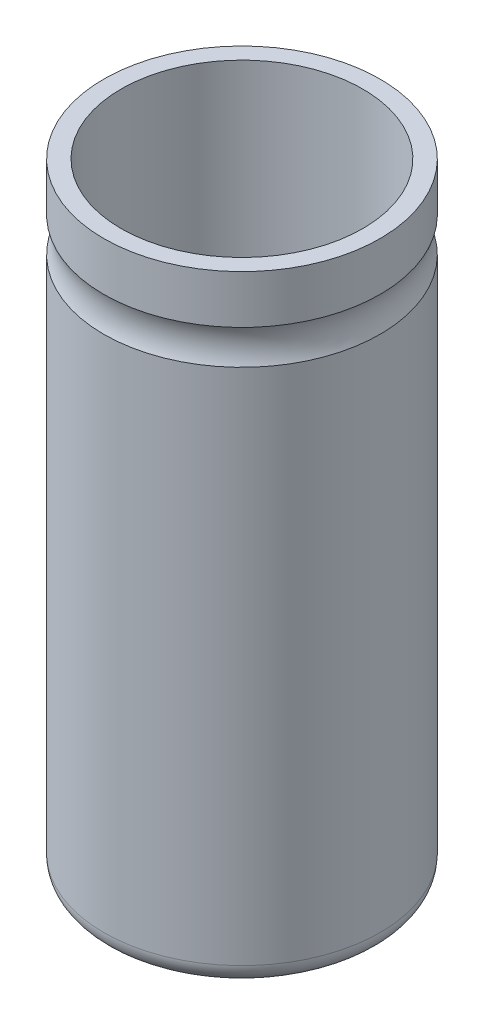
ISO-10303-21;
HEADER;
FILE_DESCRIPTION(('STEP AP214'),'2;1');
FILE_NAME('part.step','',(''),(''),'','','');
FILE_SCHEMA(('AUTOMOTIVE_DESIGN { 1 0 10303 214 1 1 1 1 }'));
ENDSEC;
DATA;
#1=APPLICATION_CONTEXT('core data for automotive mechanical design processes');
#2=APPLICATION_PROTOCOL_DEFINITION('international standard','automotive_design',2000,#1);
#3=PRODUCT_CONTEXT('',#1,'mechanical');
#4=PRODUCT('Part','Part','',(#3));
#5=PRODUCT_RELATED_PRODUCT_CATEGORY('part','',(#4));
#6=PRODUCT_DEFINITION_FORMATION('','',#4);
#7=PRODUCT_DEFINITION_CONTEXT('part definition',#1,'design');
#8=PRODUCT_DEFINITION('design','',#6,#7);
#9=PRODUCT_DEFINITION_SHAPE('','',#8);
#10=(LENGTH_UNIT() NAMED_UNIT(*) SI_UNIT(.MILLI.,.METRE.));
#11=(NAMED_UNIT(*) PLANE_ANGLE_UNIT() SI_UNIT($,.RADIAN.));
#12=(NAMED_UNIT(*) SI_UNIT($,.STERADIAN.) SOLID_ANGLE_UNIT());
#13=UNCERTAINTY_MEASURE_WITH_UNIT(LENGTH_MEASURE(1.E-05),#10,'distance_accuracy_value','');
#14=(GEOMETRIC_REPRESENTATION_CONTEXT(3) GLOBAL_UNCERTAINTY_ASSIGNED_CONTEXT((#13)) GLOBAL_UNIT_ASSIGNED_CONTEXT((#10,
#11,#12)) REPRESENTATION_CONTEXT('',''));
#15=CARTESIAN_POINT('',(0.,0.,0.));
#16=DIRECTION('',(0.,0.,1.));
#17=DIRECTION('',(1.,0.,0.));
#18=AXIS2_PLACEMENT_3D('',#15,#16,#17);
#19=CARTESIAN_POINT('',(0.,0.,0.));
#20=DIRECTION('',(0.,1.,0.));
#21=DIRECTION('',(0.,0.,1.));
#22=AXIS2_PLACEMENT_3D('',#19,#20,#21);
#23=PLANE('',#22);
#24=CARTESIAN_POINT('',(0.,0.,0.));
#25=DIRECTION('',(0.,1.,0.));
#26=DIRECTION('',(0.,0.,1.));
#27=AXIS2_PLACEMENT_3D('',#24,#25,#26);
#28=CIRCLE('',#27,17000.);
#29=CARTESIAN_POINT('',(0.,0.,17000.));
#30=VERTEX_POINT('',#29);
#31=EDGE_CURVE('E10',#30,#30,#28,.F.);
#32=ORIENTED_EDGE('',*,*,#31,.T.);
#33=EDGE_LOOP('',(#32));
#34=FACE_BOUND('',#33,.T.);
#35=ADVANCED_FACE('F43',(#34),#23,.F.);
#36=CARTESIAN_POINT('',(0.,3000.,0.));
#37=DIRECTION('',(0.,1.,0.));
#38=DIRECTION('',(0.,0.,1.));
#39=AXIS2_PLACEMENT_3D('',#36,#37,#38);
#40=CYLINDRICAL_SURFACE('',#39,20000.);
#41=CARTESIAN_POINT('',(0.,3000.,0.));
#42=DIRECTION('',(0.,1.,0.));
#43=DIRECTION('',(0.,0.,1.));
#44=AXIS2_PLACEMENT_3D('',#41,#42,#43);
#45=CIRCLE('',#44,20000.);
#46=CARTESIAN_POINT('',(0.,3000.,20000.));
#47=VERTEX_POINT('',#46);
#48=EDGE_CURVE('E51',#47,#47,#45,.T.);
#49=ORIENTED_EDGE('',*,*,#48,.T.);
#50=EDGE_LOOP('',(#49));
#51=FACE_BOUND('',#50,.T.);
#52=CARTESIAN_POINT('',(0.,78000.,0.));
#53=DIRECTION('',(0.,1.,0.));
#54=DIRECTION('',(0.,0.,1.));
#55=AXIS2_PLACEMENT_3D('',#52,#53,#54);
#56=CIRCLE('',#55,20000.);
#57=CARTESIAN_POINT('',(0.,78000.,20000.));
#58=VERTEX_POINT('',#57);
#59=EDGE_CURVE('E56',#58,#58,#56,.T.);
#60=ORIENTED_EDGE('',*,*,#59,.F.);
#61=EDGE_LOOP('',(#60));
#62=FACE_BOUND('',#61,.T.);
#63=ADVANCED_FACE('F103',(#51,#62),#40,.T.);
#64=CARTESIAN_POINT('',(0.,80500.,0.));
#65=DIRECTION('',(0.,1.,0.));
#66=DIRECTION('',(0.,0.,1.));
#67=AXIS2_PLACEMENT_3D('',#64,#65,#66);
#68=TOROIDAL_SURFACE('',#67,25454.3560573179,6000.);
#69=CARTESIAN_POINT('',(0.,83000.,0.));
#70=DIRECTION('',(0.,1.,0.));
#71=DIRECTION('',(0.,0.,1.));
#72=AXIS2_PLACEMENT_3D('',#69,#70,#71);
#73=CIRCLE('',#72,20000.);
#74=CARTESIAN_POINT('',(0.,83000.,20000.));
#75=VERTEX_POINT('',#74);
#76=EDGE_CURVE('E61',#75,#75,#73,.T.);
#77=ORIENTED_EDGE('',*,*,#76,.F.);
#78=EDGE_LOOP('',(#77));
#79=FACE_BOUND('',#78,.T.);
#80=ORIENTED_EDGE('',*,*,#59,.T.);
#81=EDGE_LOOP('',(#80));
#82=FACE_BOUND('',#81,.T.);
#83=ADVANCED_FACE('F97',(#79,#82),#68,.F.);
#84=CARTESIAN_POINT('',(0.,3000.,0.));
#85=DIRECTION('',(0.,1.,0.));
#86=DIRECTION('',(0.,0.,1.));
#87=AXIS2_PLACEMENT_3D('',#84,#85,#86);
#88=CYLINDRICAL_SURFACE('',#87,20000.);
#89=CARTESIAN_POINT('',(0.,90000.,0.));
#90=DIRECTION('',(0.,1.,0.));
#91=DIRECTION('',(0.,0.,1.));
#92=AXIS2_PLACEMENT_3D('',#89,#90,#91);
#93=CIRCLE('',#92,20000.);
#94=CARTESIAN_POINT('',(0.,90000.,20000.));
#95=VERTEX_POINT('',#94);
#96=EDGE_CURVE('E67',#95,#95,#93,.T.);
#97=ORIENTED_EDGE('',*,*,#96,.F.);
#98=EDGE_LOOP('',(#97));
#99=FACE_BOUND('',#98,.T.);
#100=ORIENTED_EDGE('',*,*,#76,.T.);
#101=EDGE_LOOP('',(#100));
#102=FACE_BOUND('',#101,.T.);
#103=ADVANCED_FACE('F91',(#99,#102),#88,.T.);
#104=CARTESIAN_POINT('',(17500.,90000.,0.));
#105=DIRECTION('',(0.,-1.,0.));
#106=DIRECTION('',(0.,0.,-1.));
#107=AXIS2_PLACEMENT_3D('',#104,#105,#106);
#108=PLANE('',#107);
#109=CARTESIAN_POINT('',(0.,90000.,0.));
#110=DIRECTION('',(0.,1.,0.));
#111=DIRECTION('',(0.,0.,1.));
#112=AXIS2_PLACEMENT_3D('',#109,#110,#111);
#113=CIRCLE('',#112,17500.);
#114=CARTESIAN_POINT('',(0.,90000.,17500.));
#115=VERTEX_POINT('',#114);
#116=EDGE_CURVE('E71',#115,#115,#113,.T.);
#117=ORIENTED_EDGE('',*,*,#116,.F.);
#118=EDGE_LOOP('',(#117));
#119=FACE_BOUND('',#118,.T.);
#120=ORIENTED_EDGE('',*,*,#96,.T.);
#121=EDGE_LOOP('',(#120));
#122=FACE_BOUND('',#121,.T.);
#123=ADVANCED_FACE('F85',(#119,#122),#108,.F.);
#124=CARTESIAN_POINT('',(0.,3000.,0.));
#125=DIRECTION('',(0.,1.,0.));
#126=DIRECTION('',(0.,0.,1.));
#127=AXIS2_PLACEMENT_3D('',#124,#125,#126);
#128=CYLINDRICAL_SURFACE('',#127,17500.);
#129=CARTESIAN_POINT('',(0.,3000.,0.));
#130=DIRECTION('',(0.,1.,0.));
#131=DIRECTION('',(0.,0.,1.));
#132=AXIS2_PLACEMENT_3D('',#129,#130,#131);
#133=CIRCLE('',#132,17500.);
#134=CARTESIAN_POINT('',(0.,3000.,17500.));
#135=VERTEX_POINT('',#134);
#136=EDGE_CURVE('E75',#135,#135,#133,.T.);
#137=ORIENTED_EDGE('',*,*,#136,.F.);
#138=EDGE_LOOP('',(#137));
#139=FACE_BOUND('',#138,.T.);
#140=ORIENTED_EDGE('',*,*,#116,.T.);
#141=EDGE_LOOP('',(#140));
#142=FACE_BOUND('',#141,.T.);
#143=ADVANCED_FACE('F82',(#139,#142),#128,.F.);
#144=CARTESIAN_POINT('',(17500.,3000.,0.));
#145=DIRECTION('',(0.,-1.,0.));
#146=DIRECTION('',(0.,0.,-1.));
#147=AXIS2_PLACEMENT_3D('',#144,#145,#146);
#148=PLANE('',#147);
#149=ORIENTED_EDGE('',*,*,#136,.T.);
#150=EDGE_LOOP('',(#149));
#151=FACE_BOUND('',#150,.T.);
#152=ADVANCED_FACE('F80',(#151),#148,.F.);
#153=CARTESIAN_POINT('',(0.,3000.,0.));
#154=DIRECTION('',(0.,1.,0.));
#155=DIRECTION('',(0.,0.,1.));
#156=AXIS2_PLACEMENT_3D('',#153,#154,#155);
#157=TOROIDAL_SURFACE('',#156,17000.,3000.);
#158=ORIENTED_EDGE('',*,*,#31,.F.);
#159=EDGE_LOOP('',(#158));
#160=FACE_BOUND('',#159,.T.);
#161=ORIENTED_EDGE('',*,*,#48,.F.);
#162=EDGE_LOOP('',(#161));
#163=FACE_BOUND('',#162,.T.);
#164=ADVANCED_FACE('F45',(#160,#163),#157,.T.);
#165=CLOSED_SHELL('',(#35,#63,#83,#103,#123,#143,#152,#164));
#166=MANIFOLD_SOLID_BREP('B2',#165);
#167=ADVANCED_BREP_SHAPE_REPRESENTATION('',(#18,#166),#14);
#168=SHAPE_DEFINITION_REPRESENTATION(#9,#167);
ENDSEC;
END-ISO-10303-21;
